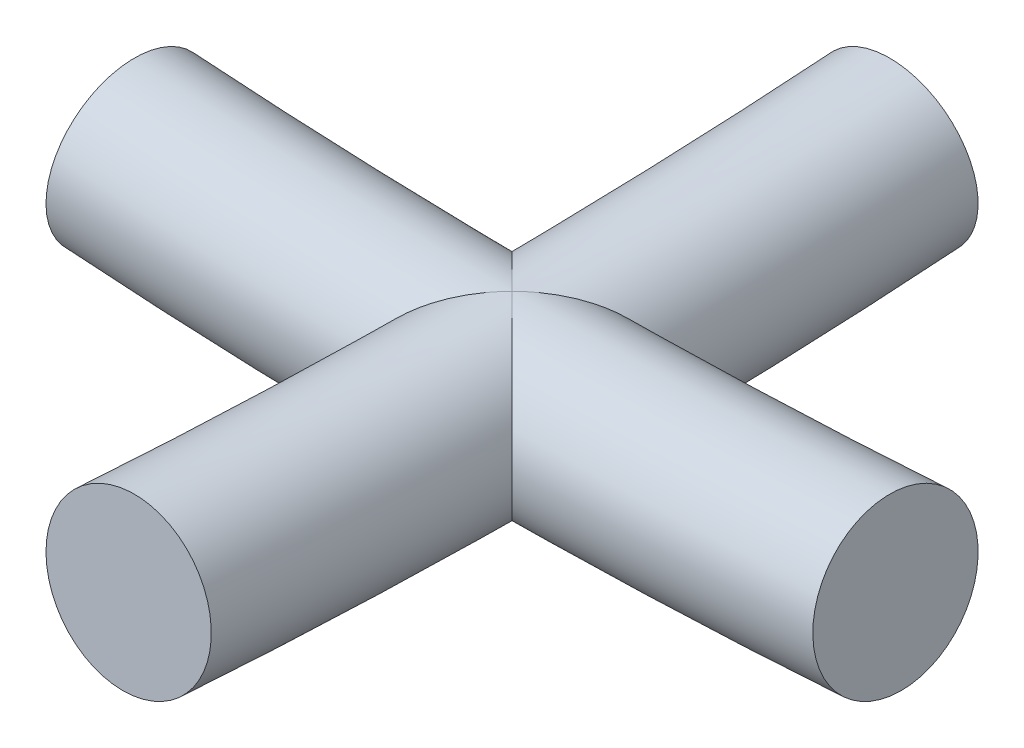
ISO-10303-21;
HEADER;
FILE_DESCRIPTION(('STEP AP214'),'2;1');
FILE_NAME('part.step','',(''),(''),'','','');
FILE_SCHEMA(('AUTOMOTIVE_DESIGN { 1 0 10303 214 1 1 1 1 }'));
ENDSEC;
DATA;
#1=APPLICATION_CONTEXT('core data for automotive mechanical design processes');
#2=APPLICATION_PROTOCOL_DEFINITION('international standard','automotive_design',2000,#1);
#3=PRODUCT_CONTEXT('',#1,'mechanical');
#4=PRODUCT('Part','Part','',(#3));
#5=PRODUCT_RELATED_PRODUCT_CATEGORY('part','',(#4));
#6=PRODUCT_DEFINITION_FORMATION('','',#4);
#7=PRODUCT_DEFINITION_CONTEXT('part definition',#1,'design');
#8=PRODUCT_DEFINITION('design','',#6,#7);
#9=PRODUCT_DEFINITION_SHAPE('','',#8);
#10=(LENGTH_UNIT() NAMED_UNIT(*) SI_UNIT(.MILLI.,.METRE.));
#11=(NAMED_UNIT(*) PLANE_ANGLE_UNIT() SI_UNIT($,.RADIAN.));
#12=(NAMED_UNIT(*) SI_UNIT($,.STERADIAN.) SOLID_ANGLE_UNIT());
#13=UNCERTAINTY_MEASURE_WITH_UNIT(LENGTH_MEASURE(1.E-05),#10,'distance_accuracy_value','');
#14=(GEOMETRIC_REPRESENTATION_CONTEXT(3) GLOBAL_UNCERTAINTY_ASSIGNED_CONTEXT((#13)) GLOBAL_UNIT_ASSIGNED_CONTEXT((#10,
#11,#12)) REPRESENTATION_CONTEXT('',''));
#15=CARTESIAN_POINT('',(0.,0.,0.));
#16=DIRECTION('',(0.,0.,1.));
#17=DIRECTION('',(1.,0.,0.));
#18=AXIS2_PLACEMENT_3D('',#15,#16,#17);
#19=CARTESIAN_POINT('',(0.,0.,0.));
#20=DIRECTION('',(1.,0.,0.));
#21=DIRECTION('',(0.,0.,-1.));
#22=AXIS2_PLACEMENT_3D('',#19,#20,#21);
#23=TOROIDAL_SURFACE('',#22,500.,7.5);
#24=CARTESIAN_POINT('',(0.,-498.782025129912,34.8782368720627));
#25=DIRECTION('',(0.,0.0697564737441254,0.997564050259824));
#26=DIRECTION('',(1.,0.,0.));
#27=AXIS2_PLACEMENT_3D('',#24,#25,#26);
#28=CIRCLE('',#27,7.5);
#29=CARTESIAN_POINT('',(7.5,-498.782025129912,34.8782368720627));
#30=VERTEX_POINT('',#29);
#31=EDGE_CURVE('E63',#30,#30,#28,.T.);
#32=ORIENTED_EDGE('',*,*,#31,.F.);
#33=EDGE_LOOP('',(#32));
#34=FACE_BOUND('',#33,.T.);
#35=CARTESIAN_POINT('',(0.,-492.5,0.));
#36=CARTESIAN_POINT('',(0.00405172274306531,-492.500000002465,0.00405172274300499));
#37=CARTESIAN_POINT('',(0.00810347235606191,-492.500003235684,0.0081034723560016));
#38=CARTESIAN_POINT('',(0.30412747375519,-492.500475521397,0.30412747375513));
#39=CARTESIAN_POINT('',(0.596223350613864,-492.517719478198,0.596223350613803));
#40=CARTESIAN_POINT('',(1.17860997817004,-492.586052900552,1.17860997816998));
#41=CARTESIAN_POINT('',(1.46889907334523,-492.637169795271,1.46889907334517));
#42=CARTESIAN_POINT('',(2.04599874856979,-492.774192245623,2.04599874856973));
#43=CARTESIAN_POINT('',(2.33280098382238,-492.860168858014,2.33280098382232));
#44=CARTESIAN_POINT('',(2.89968640547073,-493.068170051108,2.89968640547067));
#45=CARTESIAN_POINT('',(3.17977354880976,-493.190172808933,3.1797735488097));
#46=CARTESIAN_POINT('',(3.64189763278578,-493.426803594531,3.64189763278572));
#47=CARTESIAN_POINT('',(3.8265517152731,-493.531230649731,3.82655171527304));
#48=CARTESIAN_POINT('',(4.19013890945707,-493.758183584028,4.19013890945701));
#49=CARTESIAN_POINT('',(4.36907213466653,-493.880709103745,4.36907213466647));
#50=CARTESIAN_POINT('',(4.89471207725531,-494.276293240661,4.89471207725525));
#51=CARTESIAN_POINT('',(5.23135241857838,-494.577901951831,5.23135241857832));
#52=CARTESIAN_POINT('',(5.66269171513338,-495.046842414186,5.66269171513332));
#53=CARTESIAN_POINT('',(5.77663207807122,-495.179642106875,5.77663207807116));
#54=CARTESIAN_POINT('',(5.9973891511842,-495.456714846741,5.99738915118414));
#55=CARTESIAN_POINT('',(6.10420588545214,-495.600987855111,6.10420588545208));
#56=CARTESIAN_POINT('',(6.30937966420669,-495.900920649429,6.30937966420663));
#57=CARTESIAN_POINT('',(6.40774276916204,-496.056572127392,6.40774276916198));
#58=CARTESIAN_POINT('',(6.59467565510937,-496.379143868614,6.59467565510931));
#59=CARTESIAN_POINT('',(6.68325116657417,-496.546057444903,6.68325116657411));
#60=CARTESIAN_POINT('',(6.83250008782514,-496.856162785988,6.83250008782508));
#61=CARTESIAN_POINT('',(6.89520703463394,-496.997400371629,6.89520703463388));
#62=CARTESIAN_POINT('',(7.01259020844343,-497.286333633437,7.01259020844337));
#63=CARTESIAN_POINT('',(7.06727051426101,-497.434025979691,7.06727051426094));
#64=CARTESIAN_POINT('',(7.16780864980149,-497.735265923292,7.16780864980143));
#65=CARTESIAN_POINT('',(7.21366902057639,-497.888811818891,7.21366902057633));
#66=CARTESIAN_POINT('',(7.29582258392754,-498.200960973281,7.29582258392748));
#67=CARTESIAN_POINT('',(7.33211567371422,-498.359564286387,7.33211567371416));
#68=CARTESIAN_POINT('',(7.39466754778453,-498.681793597484,7.39466754778447));
#69=CARTESIAN_POINT('',(7.42086033344639,-498.845445327509,7.42086033344633));
#70=CARTESIAN_POINT('',(7.46235993995,-499.175497687257,7.46235993994994));
#71=CARTESIAN_POINT('',(7.47766672989689,-499.341898324781,7.47766672989683));
#72=CARTESIAN_POINT('',(7.49708700520648,-499.675962005662,7.49708700520642));
#73=CARTESIAN_POINT('',(7.5012032851292,-499.843624723357,7.50120328512914));
#74=CARTESIAN_POINT('',(7.49819059113224,-500.178738845475,7.49819059113217));
#75=CARTESIAN_POINT('',(7.49106242490943,-500.346190264213,7.49106242490937));
#76=CARTESIAN_POINT('',(7.46704113695181,-500.6625119158,7.46704113695175));
#77=CARTESIAN_POINT('',(7.45121019192246,-500.811546307664,7.4512101919224));
#78=CARTESIAN_POINT('',(7.41091735722183,-501.107309623359,7.41091735722177));
#79=CARTESIAN_POINT('',(7.38645262623401,-501.254037771596,7.38645262623395));
#80=CARTESIAN_POINT('',(7.32931919351315,-501.544203758762,7.32931919351309));
#81=CARTESIAN_POINT('',(7.29665297759097,-501.68764258031,7.29665297759091));
#82=CARTESIAN_POINT('',(7.22360533429434,-501.970584582745,7.22360533429428));
#83=CARTESIAN_POINT('',(7.18322086617363,-502.11008618755,7.18322086617357));
#84=CARTESIAN_POINT('',(7.09298483451151,-502.391731169253,7.09298483451145));
#85=CARTESIAN_POINT('',(7.04274659558109,-502.533626518945,7.04274659558102));
#86=CARTESIAN_POINT('',(6.93501880569529,-502.811825131596,6.93501880569523));
#87=CARTESIAN_POINT('',(6.87752691094487,-502.948126568104,6.8775269109448));
#88=CARTESIAN_POINT('',(6.6952051387422,-503.348001265091,6.69520513874213));
#89=CARTESIAN_POINT('',(6.56050056443409,-503.602632191103,6.56050056443403));
#90=CARTESIAN_POINT('',(6.19057955654988,-504.218190621189,6.19057955654982));
#91=CARTESIAN_POINT('',(5.94059235257446,-504.561427007098,5.9405923525744));
#92=CARTESIAN_POINT('',(5.53921051129636,-505.030202068354,5.5392105112963));
#93=CARTESIAN_POINT('',(5.40076363574845,-505.178989710427,5.40076363574839));
#94=CARTESIAN_POINT('',(5.1163811368633,-505.461599347489,5.11638113686323));
#95=CARTESIAN_POINT('',(4.97044551049435,-505.59542133642,4.97044551049429));
#96=CARTESIAN_POINT('',(4.61104580854305,-505.900494618956,4.61104580854299));
#97=CARTESIAN_POINT('',(4.39450170738373,-506.064492777644,4.39450170738367));
#98=CARTESIAN_POINT('',(3.95190284198422,-506.364551978632,3.95190284198416));
#99=CARTESIAN_POINT('',(3.72584369394182,-506.500599970071,3.72584369394176));
#100=CARTESIAN_POINT('',(3.26649942040137,-506.745809933948,3.26649942040131));
#101=CARTESIAN_POINT('',(3.03321210724088,-506.854963675351,3.03321210724081));
#102=CARTESIAN_POINT('',(2.56144798014355,-507.04720769992,2.56144798014349));
#103=CARTESIAN_POINT('',(2.32297273824901,-507.130305763987,2.32297273824896));
#104=CARTESIAN_POINT('',(1.74214076296989,-507.300590048811,1.74214076296982));
#105=CARTESIAN_POINT('',(1.39790050721653,-507.375053964731,1.39790050721645));
#106=CARTESIAN_POINT('',(0.706477363017954,-507.474417154022,0.706477363017903));
#107=CARTESIAN_POINT('',(0.359301337173446,-507.499410666167,0.359301337173438));
#108=CARTESIAN_POINT('',(0.00822594398091709,-507.499996564072,0.0082259439808562));
#109=CARTESIAN_POINT('',(0.00411295530615033,-507.499999997282,0.00411295530608882));
#110=CARTESIAN_POINT('',(0.,-507.5,0.));
#111=B_SPLINE_CURVE_WITH_KNOTS('',3,(#35,#36,#37,#38,#39,#40,#41,#42,#43,#44,#45,#46,#47,#48,
#49,#50,#51,#52,#53,#54,#55,#56,#57,#58,#59,#60,#61,#62,#63,#64,#65,#66,#67,#68,#69,#70,#71,#72,
#73,#74,#75,#76,#77,#78,#79,#80,#81,#82,#83,#84,#85,#86,#87,#88,#89,#90,#91,#92,#93,#94,#95,#96,
#97,#98,#99,#100,#101,#102,#103,#104,#105,#106,#107,#108,#109,#110),.UNSPECIFIED.,.F.,.F.,(4,2,
2,2,2,2,2,2,2,2,2,2,2,2,2,2,2,2,2,2,2,2,2,2,2,2,2,2,2,2,2,2,2,2,2,2,2,4),(0.,0.017190116174422,
1.25591597569802,2.4956461415085,3.73791613445178,4.97943515928004,5.82247951760151,
6.6655071379076,8.34668699965468,8.97271634482864,9.5987435726035,10.2243181865191,
10.8495245742734,11.3493707895381,11.8489621171227,12.3484092944911,12.8478618376328,
13.350524790622,13.8531891701816,14.355728009898,14.8582307535219,15.3098371563942,
15.7615923184735,16.2132107217727,16.6650074165209,17.1406067607188,17.6163601756342,
18.567581132254,20.037167528878,20.7744210277339,21.5116748250576,22.5522569936114,
23.593323945694,24.6347091235853,25.6757830200464,27.1506210298236,28.6226468287827,
28.6400967601891),.UNSPECIFIED.);
#112=CARTESIAN_POINT('',(0.,-492.5,0.));
#113=VERTEX_POINT('',#112);
#114=CARTESIAN_POINT('',(0.,-507.5,0.));
#115=VERTEX_POINT('',#114);
#116=EDGE_CURVE('E11',#113,#115,#111,.T.);
#117=ORIENTED_EDGE('',*,*,#116,.F.);
#118=CARTESIAN_POINT('',(0.,-507.5,0.));
#119=CARTESIAN_POINT('',(-0.00411296008684814,-507.499999998436,0.00411296008678599));
#120=CARTESIAN_POINT('',(-0.00822594877780701,-507.499996565199,0.00822594877774486));
#121=CARTESIAN_POINT('',(-0.296726746646961,-507.499515016277,0.296726746646899));
#122=CARTESIAN_POINT('',(-0.581235057174428,-507.482632736986,0.581235057174365));
#123=CARTESIAN_POINT('',(-1.14847424226384,-507.415829714857,1.14847424226378));
#124=CARTESIAN_POINT('',(-1.43120352610779,-507.365882749092,1.43120352610773));
#125=CARTESIAN_POINT('',(-1.99332412477934,-507.232193962043,1.99332412477927));
#126=CARTESIAN_POINT('',(-2.27270664054146,-507.148377396172,2.27270664054137));
#127=CARTESIAN_POINT('',(-2.82501193746472,-506.946016053837,2.82501193746468));
#128=CARTESIAN_POINT('',(-3.09793808275173,-506.827489813902,3.09793808275174));
#129=CARTESIAN_POINT('',(-3.55878209527001,-506.592946364011,3.5587820952699));
#130=CARTESIAN_POINT('',(-3.74892990001278,-506.485682923774,3.74892990001254));
#131=CARTESIAN_POINT('',(-4.12318266576039,-506.252036228184,4.12318266576014));
#132=CARTESIAN_POINT('',(-4.30728767418397,-506.12565312291,4.30728767418385));
#133=CARTESIAN_POINT('',(-4.84785184874006,-505.71711622169,4.84785184874012));
#134=CARTESIAN_POINT('',(-5.19369305259328,-505.405014980414,5.19369305259324));
#135=CARTESIAN_POINT('',(-5.63563405267224,-504.920399757939,5.63563405267217));
#136=CARTESIAN_POINT('',(-5.75187122183108,-504.783730594068,5.75187122183101));
#137=CARTESIAN_POINT('',(-5.97696516791961,-504.498757686729,5.97696516791955));
#138=CARTESIAN_POINT('',(-6.08582272649825,-504.350455179066,6.08582272649819));
#139=CARTESIAN_POINT('',(-6.39930165173129,-503.8882369744,6.39930165173123));
#140=CARTESIAN_POINT('',(-6.59128656510251,-503.556519842209,6.59128656510245));
#141=CARTESIAN_POINT('',(-6.89462143908579,-502.920990106235,6.89462143908573));
#142=CARTESIAN_POINT('',(-7.01443177285068,-502.625312843618,7.01443177285062));
#143=CARTESIAN_POINT('',(-7.16720089601508,-502.164104893629,7.16720089601502));
#144=CARTESIAN_POINT('',(-7.21364078925464,-502.007380464186,7.21364078925458));
#145=CARTESIAN_POINT('',(-7.29674965759596,-501.688864339679,7.2967496575959));
#146=CARTESIAN_POINT('',(-7.33342291781458,-501.527074901829,7.33342291781452));
#147=CARTESIAN_POINT('',(-7.39652256881554,-501.198237547431,7.39652256881548));
#148=CARTESIAN_POINT('',(-7.42287042658969,-501.031159393187,7.42287042658963));
#149=CARTESIAN_POINT('',(-7.46434225054951,-500.694223768824,7.46434225054945));
#150=CARTESIAN_POINT('',(-7.47946618560727,-500.524366291,7.47946618560721));
#151=CARTESIAN_POINT('',(-7.49810964929442,-500.18344697017,7.49810964929436));
#152=CARTESIAN_POINT('',(-7.50163392741187,-500.012385648839,7.50163392741181));
#153=CARTESIAN_POINT('',(-7.49697180256884,-499.670591481287,7.49697180256878));
#154=CARTESIAN_POINT('',(-7.488786483662,-499.499858606126,7.48878648366194));
#155=CARTESIAN_POINT('',(-7.46246499943983,-499.179736732955,7.46246499943977));
#156=CARTESIAN_POINT('',(-7.44557371661093,-499.030139511416,7.44557371661088));
#157=CARTESIAN_POINT('',(-7.40300499444454,-498.733418341218,7.40300499444449));
#158=CARTESIAN_POINT('',(-7.37732469376992,-498.586295214405,7.37732469376986));
#159=CARTESIAN_POINT('',(-7.31759864276457,-498.295547392247,7.31759864276451));
#160=CARTESIAN_POINT('',(-7.28355551159417,-498.151921617014,7.28355551159411));
#161=CARTESIAN_POINT('',(-7.20759697384567,-497.868845378402,7.20759697384561));
#162=CARTESIAN_POINT('',(-7.16567844444104,-497.729396596842,7.16567844444098));
#163=CARTESIAN_POINT('',(-7.0729372178395,-497.450502025904,7.07293721783943));
#164=CARTESIAN_POINT('',(-7.02185175620003,-497.311231239743,7.02185175619997));
#165=CARTESIAN_POINT('',(-6.9125316780674,-497.038395042459,6.91253167806734));
#166=CARTESIAN_POINT('',(-6.85429477235543,-496.90483147679,6.85429477235537));
#167=CARTESIAN_POINT('',(-6.66989643407295,-496.513338753572,6.66989643407289));
#168=CARTESIAN_POINT('',(-6.53401251007219,-496.26450501257,6.53401251007212));
#169=CARTESIAN_POINT('',(-6.16158265265473,-495.663942326435,6.16158265265467));
#170=CARTESIAN_POINT('',(-5.91055779204382,-495.330119595269,5.91055779204376));
#171=CARTESIAN_POINT('',(-5.50848374922241,-494.875414925409,5.50848374922235));
#172=CARTESIAN_POINT('',(-5.36994334249538,-494.7313109146,5.36994334249532));
#173=CARTESIAN_POINT('',(-5.08566844126367,-494.45796114918,5.08566844126361));
#174=CARTESIAN_POINT('',(-4.93993394509967,-494.328715397996,4.9399339450996));
#175=CARTESIAN_POINT('',(-4.5758697171878,-494.029918577291,4.57586971718773));
#176=CARTESIAN_POINT('',(-4.35429022079139,-493.868281329408,4.35429022079133));
#177=CARTESIAN_POINT('',(-3.90174490101171,-493.573711496582,3.90174490101165));
#178=CARTESIAN_POINT('',(-3.67077431101529,-493.440793710374,3.67077431101523));
#179=CARTESIAN_POINT('',(-3.20182715278346,-493.202328290752,3.2018271527834));
#180=CARTESIAN_POINT('',(-2.96384843958099,-493.096789136098,2.96384843958093));
#181=CARTESIAN_POINT('',(-2.4829624183365,-492.912035123732,2.48296241833644));
#182=CARTESIAN_POINT('',(-2.24005675116175,-492.832811649792,2.24005675116168));
#183=CARTESIAN_POINT('',(-1.66860889421815,-492.677395597215,1.66860889421809));
#184=CARTESIAN_POINT('',(-1.33870447612159,-492.611157118523,1.33870447612155));
#185=CARTESIAN_POINT('',(-0.676522400587747,-492.522769386523,0.676522400587656));
#186=CARTESIAN_POINT('',(-0.344250208419991,-492.500539458485,0.344250208419835));
#187=CARTESIAN_POINT('',(-0.00810346979936537,-492.500003236606,0.00810346979930272));
#188=CARTESIAN_POINT('',(-0.00405172019925466,-492.500000003406,0.00405172019919317));
#189=CARTESIAN_POINT('',(0.,-492.5,0.));
#190=B_SPLINE_CURVE_WITH_KNOTS('',3,(#118,#119,#120,#121,#122,#123,#124,#125,#126,#127,#128,
#129,#130,#131,#132,#133,#134,#135,#136,#137,#138,#139,#140,#141,#142,#143,#144,#145,#146,#147,
#148,#149,#150,#151,#152,#153,#154,#155,#156,#157,#158,#159,#160,#161,#162,#163,#164,#165,#166,
#167,#168,#169,#170,#171,#172,#173,#174,#175,#176,#177,#178,#179,#180,#181,#182,#183,#184,#185,
#186,#187,#188,#189),.UNSPECIFIED.,.F.,.F.,(4,2,2,2,2,2,2,2,2,2,2,2,2,2,2,2,2,2,2,2,2,2,2,2,2,2,
2,2,2,2,2,2,2,2,2,4),(0.,0.0174499314064598,1.22399759742011,2.4315032999273,3.64168844819305,
4.85122847805522,5.71900898120031,6.5867826731101,8.31728300330255,8.9581700357246,
9.59898907893289,10.8782161024738,11.8962056521586,12.405445112385,12.9144607739753,
13.427276070808,13.9400927898537,14.4526995095781,14.9652587761561,15.4192080783133,
15.8733053082063,16.3272605000062,16.7813960797474,17.2516147556117,17.7219843455044,
18.6623853930822,20.1157195878404,20.8448916311593,21.5740638426626,22.6301992346208,
23.6868775472256,24.7438827080057,25.8005414443621,27.2120817298534,28.6210320307507,
28.6382221469251),.UNSPECIFIED.);
#191=EDGE_CURVE('E47',#115,#113,#190,.T.);
#192=ORIENTED_EDGE('',*,*,#191,.F.);
#193=EDGE_LOOP('',(#117,#192));
#194=FACE_BOUND('',#193,.T.);
#195=ADVANCED_FACE('F34',(#34,#194),#23,.T.);
#196=CARTESIAN_POINT('',(0.,-498.782025129912,34.8782368720627));
#197=DIRECTION('',(0.,0.0697564737441254,0.997564050259824));
#198=DIRECTION('',(1.,0.,0.));
#199=AXIS2_PLACEMENT_3D('',#196,#197,#198);
#200=PLANE('',#199);
#201=ORIENTED_EDGE('',*,*,#31,.T.);
#202=EDGE_LOOP('',(#201));
#203=FACE_BOUND('',#202,.T.);
#204=ADVANCED_FACE('F94',(#203),#200,.T.);
#205=CARTESIAN_POINT('',(34.8782368720627,-498.782025129912,0.));
#206=DIRECTION('',(0.997564050259824,0.0697564737441254,0.));
#207=DIRECTION('',(0.,0.,-1.));
#208=AXIS2_PLACEMENT_3D('',#205,#206,#207);
#209=PLANE('',#208);
#210=CARTESIAN_POINT('',(34.8782368720627,-498.782025129912,0.));
#211=DIRECTION('',(0.997564050259824,0.0697564737441254,0.));
#212=DIRECTION('',(0.,0.,-1.));
#213=AXIS2_PLACEMENT_3D('',#210,#211,#212);
#214=CIRCLE('',#213,7.5);
#215=CARTESIAN_POINT('',(34.8782368720627,-498.782025129912,-7.50000000000006));
#216=VERTEX_POINT('',#215);
#217=EDGE_CURVE('E107',#216,#216,#214,.T.);
#218=ORIENTED_EDGE('',*,*,#217,.T.);
#219=EDGE_LOOP('',(#218));
#220=FACE_BOUND('',#219,.T.);
#221=ADVANCED_FACE('F86',(#220),#209,.T.);
#222=CARTESIAN_POINT('',(0.,0.,0.));
#223=DIRECTION('',(0.,0.,-1.));
#224=DIRECTION('',(-1.,0.,0.));
#225=AXIS2_PLACEMENT_3D('',#222,#223,#224);
#226=TOROIDAL_SURFACE('',#225,500.,7.5);
#227=ORIENTED_EDGE('',*,*,#217,.F.);
#228=EDGE_LOOP('',(#227));
#229=FACE_BOUND('',#228,.T.);
#230=CARTESIAN_POINT('',(0.,-507.5,0.));
#231=CARTESIAN_POINT('',(0.00411296008684814,-507.499999998436,-0.00411296008691029));
#232=CARTESIAN_POINT('',(0.008225948777807,-507.499996565199,-0.00822594877786916));
#233=CARTESIAN_POINT('',(0.296726746646961,-507.499515016277,-0.296726746647023));
#234=CARTESIAN_POINT('',(0.581235057174428,-507.482632736986,-0.581235057174489));
#235=CARTESIAN_POINT('',(1.14847424226384,-507.415829714857,-1.1484742422639));
#236=CARTESIAN_POINT('',(1.43120352610779,-507.365882749092,-1.43120352610785));
#237=CARTESIAN_POINT('',(1.99332412477933,-507.232193962043,-1.99332412477939));
#238=CARTESIAN_POINT('',(2.27270664054144,-507.148377396172,-2.2727066405415));
#239=CARTESIAN_POINT('',(2.82501193746473,-506.946016053837,-2.82501193746479));
#240=CARTESIAN_POINT('',(3.09793808275178,-506.827489813902,-3.09793808275184));
#241=CARTESIAN_POINT('',(3.55878209526998,-506.592946364011,-3.55878209527004));
#242=CARTESIAN_POINT('',(3.74892990001267,-506.485682923774,-3.74892990001274));
#243=CARTESIAN_POINT('',(4.12318266576028,-506.252036228184,-4.12318266576034));
#244=CARTESIAN_POINT('',(4.30728767418394,-506.12565312291,-4.307287674184));
#245=CARTESIAN_POINT('',(4.84785184874015,-505.71711622169,-4.84785184874021));
#246=CARTESIAN_POINT('',(5.1936930525933,-505.405014980414,-5.19369305259336));
#247=CARTESIAN_POINT('',(5.63563405267224,-504.920399757939,-5.6356340526723));
#248=CARTESIAN_POINT('',(5.75187122183108,-504.783730594068,-5.75187122183114));
#249=CARTESIAN_POINT('',(5.97696516791961,-504.498757686729,-5.97696516791967));
#250=CARTESIAN_POINT('',(6.08582272649825,-504.350455179066,-6.08582272649832));
#251=CARTESIAN_POINT('',(6.39930165173129,-503.8882369744,-6.39930165173136));
#252=CARTESIAN_POINT('',(6.59128656510251,-503.556519842209,-6.59128656510258));
#253=CARTESIAN_POINT('',(6.8946214390858,-502.920990106235,-6.89462143908586));
#254=CARTESIAN_POINT('',(7.01443177285069,-502.625312843618,-7.01443177285075));
#255=CARTESIAN_POINT('',(7.16720089601509,-502.164104893629,-7.16720089601515));
#256=CARTESIAN_POINT('',(7.21364078925466,-502.007380464186,-7.21364078925472));
#257=CARTESIAN_POINT('',(7.29674965759599,-501.688864339679,-7.29674965759605));
#258=CARTESIAN_POINT('',(7.33342291781461,-501.527074901829,-7.33342291781467));
#259=CARTESIAN_POINT('',(7.39652256881556,-501.198237547431,-7.39652256881562));
#260=CARTESIAN_POINT('',(7.42287042658971,-501.031159393186,-7.42287042658977));
#261=CARTESIAN_POINT('',(7.46434225054952,-500.694223768824,-7.46434225054958));
#262=CARTESIAN_POINT('',(7.47946618560728,-500.524366291,-7.47946618560734));
#263=CARTESIAN_POINT('',(7.49810964929442,-500.18344697017,-7.49810964929448));
#264=CARTESIAN_POINT('',(7.50163392741188,-500.012385648838,-7.50163392741194));
#265=CARTESIAN_POINT('',(7.49697180256884,-499.670591481287,-7.4969718025689));
#266=CARTESIAN_POINT('',(7.48878648366199,-499.499858606126,-7.48878648366205));
#267=CARTESIAN_POINT('',(7.46246499943982,-499.179736732955,-7.46246499943989));
#268=CARTESIAN_POINT('',(7.44557371661093,-499.030139511416,-7.44557371661099));
#269=CARTESIAN_POINT('',(7.40300499444454,-498.733418341218,-7.40300499444461));
#270=CARTESIAN_POINT('',(7.37732469376992,-498.586295214405,-7.37732469376998));
#271=CARTESIAN_POINT('',(7.31759864276456,-498.295547392247,-7.31759864276462));
#272=CARTESIAN_POINT('',(7.28355551159415,-498.151921617014,-7.28355551159421));
#273=CARTESIAN_POINT('',(7.20759697384564,-497.868845378402,-7.20759697384571));
#274=CARTESIAN_POINT('',(7.16567844444101,-497.729396596842,-7.16567844444107));
#275=CARTESIAN_POINT('',(7.07293721783946,-497.450502025904,-7.07293721783952));
#276=CARTESIAN_POINT('',(7.02185175619999,-497.311231239743,-7.02185175620005));
#277=CARTESIAN_POINT('',(6.91253167806735,-497.038395042459,-6.91253167806741));
#278=CARTESIAN_POINT('',(6.85429477235538,-496.90483147679,-6.85429477235544));
#279=CARTESIAN_POINT('',(6.6698964340729,-496.513338753572,-6.66989643407296));
#280=CARTESIAN_POINT('',(6.53401251007213,-496.26450501257,-6.53401251007219));
#281=CARTESIAN_POINT('',(6.16158265265466,-495.663942326435,-6.16158265265472));
#282=CARTESIAN_POINT('',(5.91055779204374,-495.330119595269,-5.9105577920438));
#283=CARTESIAN_POINT('',(5.5084837492223,-494.875414925409,-5.50848374922237));
#284=CARTESIAN_POINT('',(5.36994334249527,-494.7313109146,-5.36994334249533));
#285=CARTESIAN_POINT('',(5.08566844126356,-494.45796114918,-5.08566844126362));
#286=CARTESIAN_POINT('',(4.93993394509956,-494.328715397995,-4.93993394509962));
#287=CARTESIAN_POINT('',(4.57586971718769,-494.029918577291,-4.57586971718775));
#288=CARTESIAN_POINT('',(4.35429022079127,-493.868281329408,-4.35429022079133));
#289=CARTESIAN_POINT('',(3.90174490101157,-493.573711496582,-3.90174490101163));
#290=CARTESIAN_POINT('',(3.67077431101514,-493.440793710374,-3.67077431101519));
#291=CARTESIAN_POINT('',(3.20182715278329,-493.202328290752,-3.20182715278335));
#292=CARTESIAN_POINT('',(2.96384843958081,-493.096789136098,-2.96384843958088));
#293=CARTESIAN_POINT('',(2.48296241833631,-492.912035123732,-2.48296241833637));
#294=CARTESIAN_POINT('',(2.24005675116155,-492.832811649792,-2.24005675116161));
#295=CARTESIAN_POINT('',(1.66860889421798,-492.677395597215,-1.66860889421804));
#296=CARTESIAN_POINT('',(1.33870447612146,-492.611157118523,-1.33870447612153));
#297=CARTESIAN_POINT('',(0.67652240058766,-492.522769386523,-0.676522400587725));
#298=CARTESIAN_POINT('',(0.344250208419909,-492.500539458485,-0.344250208419969));
#299=CARTESIAN_POINT('',(0.00810346979936407,-492.500003236606,-0.00810346979942436));
#300=CARTESIAN_POINT('',(0.004051720199254,-492.500000003406,-0.0040517201993143));
#301=CARTESIAN_POINT('',(0.,-492.5,0.));
#302=B_SPLINE_CURVE_WITH_KNOTS('',3,(#230,#231,#232,#233,#234,#235,#236,#237,#238,#239,#240,
#241,#242,#243,#244,#245,#246,#247,#248,#249,#250,#251,#252,#253,#254,#255,#256,#257,#258,#259,
#260,#261,#262,#263,#264,#265,#266,#267,#268,#269,#270,#271,#272,#273,#274,#275,#276,#277,#278,
#279,#280,#281,#282,#283,#284,#285,#286,#287,#288,#289,#290,#291,#292,#293,#294,#295,#296,#297,
#298,#299,#300,#301),.UNSPECIFIED.,.F.,.F.,(4,2,2,2,2,2,2,2,2,2,2,2,2,2,2,2,2,2,2,2,2,2,2,2,2,2,
2,2,2,2,2,2,2,2,2,4),(0.,0.0174499314064598,1.22399759742011,2.4315032999273,3.64168844819305,
4.85122847805522,5.71900898120033,6.58678267311009,8.31728300330255,8.95817003572459,
9.59898907893288,10.8782161024738,11.8962056521586,12.4054451123851,12.9144607739754,
13.4272760708081,13.9400927898538,14.4526995095782,14.9652587761562,15.4192080783134,
15.8733053082062,16.3272605000063,16.7813960797475,17.2516147556118,17.7219843455045,
18.6623853930823,20.1157195878406,20.8448916311595,21.5740638426628,22.630199234621,
23.6868775472259,24.7438827080059,25.8005414443624,27.2120817298535,28.6210320307507,
28.6382221469251),.UNSPECIFIED.);
#303=EDGE_CURVE('E57',#115,#113,#302,.T.);
#304=ORIENTED_EDGE('',*,*,#303,.T.);
#305=ORIENTED_EDGE('',*,*,#116,.T.);
#306=EDGE_LOOP('',(#304,#305));
#307=FACE_BOUND('',#306,.T.);
#308=ADVANCED_FACE('F56',(#229,#307),#226,.T.);
#309=CARTESIAN_POINT('',(0.,-498.782025129912,-34.8782368720627));
#310=DIRECTION('',(0.,-0.0697564737441255,0.997564050259824));
#311=DIRECTION('',(1.,0.,0.));
#312=AXIS2_PLACEMENT_3D('',#309,#310,#311);
#313=PLANE('',#312);
#314=CARTESIAN_POINT('',(0.,-498.782025129912,-34.8782368720627));
#315=DIRECTION('',(0.,-0.0697564737441255,0.997564050259824));
#316=DIRECTION('',(1.,0.,0.));
#317=AXIS2_PLACEMENT_3D('',#314,#315,#316);
#318=CIRCLE('',#317,7.5);
#319=CARTESIAN_POINT('',(7.5,-498.782025129912,-34.8782368720627));
#320=VERTEX_POINT('',#319);
#321=EDGE_CURVE('E105',#320,#320,#318,.T.);
#322=ORIENTED_EDGE('',*,*,#321,.F.);
#323=EDGE_LOOP('',(#322));
#324=FACE_BOUND('',#323,.T.);
#325=ADVANCED_FACE('F85',(#324),#313,.F.);
#326=ORIENTED_EDGE('',*,*,#321,.T.);
#327=EDGE_LOOP('',(#326));
#328=FACE_BOUND('',#327,.T.);
#329=CARTESIAN_POINT('',(0.,-492.5,0.));
#330=CARTESIAN_POINT('',(-0.0040517227430653,-492.500000002465,-0.00405172274312562));
#331=CARTESIAN_POINT('',(-0.00810347235606191,-492.500003235684,-0.00810347235612223));
#332=CARTESIAN_POINT('',(-0.30412747375519,-492.500475521397,-0.30412747375525));
#333=CARTESIAN_POINT('',(-0.596223350613867,-492.517719478198,-0.596223350613921));
#334=CARTESIAN_POINT('',(-1.17860997817004,-492.586052900552,-1.17860997817009));
#335=CARTESIAN_POINT('',(-1.46889907334523,-492.637169795271,-1.46889907334529));
#336=CARTESIAN_POINT('',(-2.04599874856978,-492.774192245623,-2.04599874856985));
#337=CARTESIAN_POINT('',(-2.33280098382238,-492.860168858014,-2.33280098382244));
#338=CARTESIAN_POINT('',(-2.89968640547073,-493.068170051108,-2.89968640547079));
#339=CARTESIAN_POINT('',(-3.17977354880976,-493.190172808933,-3.17977354880982));
#340=CARTESIAN_POINT('',(-3.64189763278578,-493.426803594531,-3.64189763278584));
#341=CARTESIAN_POINT('',(-3.8265517152731,-493.531230649731,-3.82655171527316));
#342=CARTESIAN_POINT('',(-4.19013890945707,-493.758183584028,-4.19013890945713));
#343=CARTESIAN_POINT('',(-4.36907213466653,-493.880709103745,-4.36907213466659));
#344=CARTESIAN_POINT('',(-4.89471207725531,-494.276293240661,-4.89471207725537));
#345=CARTESIAN_POINT('',(-5.23135241857836,-494.577901951831,-5.23135241857843));
#346=CARTESIAN_POINT('',(-5.66269171513337,-495.046842414186,-5.66269171513343));
#347=CARTESIAN_POINT('',(-5.77663207807121,-495.179642106875,-5.77663207807127));
#348=CARTESIAN_POINT('',(-5.99738915118419,-495.456714846741,-5.99738915118425));
#349=CARTESIAN_POINT('',(-6.10420588545213,-495.600987855111,-6.10420588545219));
#350=CARTESIAN_POINT('',(-6.30937966420668,-495.900920649429,-6.30937966420674));
#351=CARTESIAN_POINT('',(-6.40774276916204,-496.056572127392,-6.4077427691621));
#352=CARTESIAN_POINT('',(-6.59467565510937,-496.379143868614,-6.59467565510943));
#353=CARTESIAN_POINT('',(-6.68325116657417,-496.546057444903,-6.68325116657423));
#354=CARTESIAN_POINT('',(-6.83250008782514,-496.856162785988,-6.8325000878252));
#355=CARTESIAN_POINT('',(-6.89520703463394,-496.997400371629,-6.895207034634));
#356=CARTESIAN_POINT('',(-7.01259020844343,-497.286333633437,-7.01259020844349));
#357=CARTESIAN_POINT('',(-7.06727051426101,-497.434025979691,-7.06727051426107));
#358=CARTESIAN_POINT('',(-7.16780864980149,-497.735265923292,-7.16780864980155));
#359=CARTESIAN_POINT('',(-7.21366902057639,-497.888811818891,-7.21366902057646));
#360=CARTESIAN_POINT('',(-7.29582258392754,-498.200960973281,-7.2958225839276));
#361=CARTESIAN_POINT('',(-7.33211567371422,-498.359564286387,-7.33211567371428));
#362=CARTESIAN_POINT('',(-7.39466754778453,-498.681793597484,-7.39466754778459));
#363=CARTESIAN_POINT('',(-7.42086033344639,-498.845445327509,-7.42086033344645));
#364=CARTESIAN_POINT('',(-7.46235993995,-499.175497687257,-7.46235993995006));
#365=CARTESIAN_POINT('',(-7.47766672989689,-499.341898324781,-7.47766672989696));
#366=CARTESIAN_POINT('',(-7.49708700520648,-499.675962005662,-7.49708700520654));
#367=CARTESIAN_POINT('',(-7.5012032851292,-499.843624723357,-7.50120328512926));
#368=CARTESIAN_POINT('',(-7.49819059113224,-500.178738845475,-7.4981905911323));
#369=CARTESIAN_POINT('',(-7.49106242490943,-500.346190264213,-7.49106242490949));
#370=CARTESIAN_POINT('',(-7.46704113695181,-500.6625119158,-7.46704113695187));
#371=CARTESIAN_POINT('',(-7.45121019192246,-500.811546307664,-7.45121019192252));
#372=CARTESIAN_POINT('',(-7.41091735722183,-501.107309623359,-7.4109173572219));
#373=CARTESIAN_POINT('',(-7.38645262623401,-501.254037771596,-7.38645262623407));
#374=CARTESIAN_POINT('',(-7.32931919351315,-501.544203758762,-7.32931919351321));
#375=CARTESIAN_POINT('',(-7.29665297759097,-501.68764258031,-7.29665297759103));
#376=CARTESIAN_POINT('',(-7.22360533429434,-501.970584582745,-7.2236053342944));
#377=CARTESIAN_POINT('',(-7.18322086617363,-502.11008618755,-7.18322086617369));
#378=CARTESIAN_POINT('',(-7.09298483451151,-502.391731169253,-7.09298483451157));
#379=CARTESIAN_POINT('',(-7.04274659558109,-502.533626518945,-7.04274659558115));
#380=CARTESIAN_POINT('',(-6.93501880569529,-502.811825131596,-6.93501880569535));
#381=CARTESIAN_POINT('',(-6.87752691094487,-502.948126568104,-6.87752691094493));
#382=CARTESIAN_POINT('',(-6.6952051387422,-503.348001265091,-6.69520513874226));
#383=CARTESIAN_POINT('',(-6.56050056443409,-503.602632191103,-6.56050056443415));
#384=CARTESIAN_POINT('',(-6.19057955654988,-504.218190621189,-6.19057955654994));
#385=CARTESIAN_POINT('',(-5.94059235257445,-504.561427007098,-5.94059235257451));
#386=CARTESIAN_POINT('',(-5.53921051129638,-505.030202068354,-5.53921051129644));
#387=CARTESIAN_POINT('',(-5.40076363574848,-505.178989710427,-5.40076363574854));
#388=CARTESIAN_POINT('',(-5.11638113686332,-505.461599347489,-5.11638113686339));
#389=CARTESIAN_POINT('',(-4.97044551049436,-505.59542133642,-4.97044551049443));
#390=CARTESIAN_POINT('',(-4.61104580854305,-505.900494618956,-4.61104580854311));
#391=CARTESIAN_POINT('',(-4.39450170738375,-506.064492777644,-4.39450170738381));
#392=CARTESIAN_POINT('',(-3.95190284198424,-506.364551978632,-3.9519028419843));
#393=CARTESIAN_POINT('',(-3.72584369394183,-506.500599970071,-3.72584369394189));
#394=CARTESIAN_POINT('',(-3.26649942040137,-506.745809933948,-3.26649942040143));
#395=CARTESIAN_POINT('',(-3.03321210724088,-506.854963675351,-3.03321210724094));
#396=CARTESIAN_POINT('',(-2.56144798014355,-507.04720769992,-2.56144798014361));
#397=CARTESIAN_POINT('',(-2.32297273824902,-507.130305763987,-2.32297273824908));
#398=CARTESIAN_POINT('',(-1.74214076296989,-507.300590048811,-1.74214076296995));
#399=CARTESIAN_POINT('',(-1.39790050721652,-507.375053964731,-1.39790050721658));
#400=CARTESIAN_POINT('',(-0.706477363017963,-507.474417154022,-0.70647736301802));
#401=CARTESIAN_POINT('',(-0.359301337173475,-507.499410666167,-0.359301337173533));
#402=CARTESIAN_POINT('',(-0.00822594398091707,-507.499996564072,-0.00822594398097913));
#403=CARTESIAN_POINT('',(-0.00411295530615033,-507.499999997282,-0.00411295530621243));
#404=CARTESIAN_POINT('',(0.,-507.5,0.));
#405=B_SPLINE_CURVE_WITH_KNOTS('',3,(#329,#330,#331,#332,#333,#334,#335,#336,#337,#338,#339,
#340,#341,#342,#343,#344,#345,#346,#347,#348,#349,#350,#351,#352,#353,#354,#355,#356,#357,#358,
#359,#360,#361,#362,#363,#364,#365,#366,#367,#368,#369,#370,#371,#372,#373,#374,#375,#376,#377,
#378,#379,#380,#381,#382,#383,#384,#385,#386,#387,#388,#389,#390,#391,#392,#393,#394,#395,#396,
#397,#398,#399,#400,#401,#402,#403,#404),.UNSPECIFIED.,.F.,.F.,(4,2,2,2,2,2,2,2,2,2,2,2,2,2,2,2,
2,2,2,2,2,2,2,2,2,2,2,2,2,2,2,2,2,2,2,2,2,4),(0.,0.017190116174422,1.25591597569802,
2.4956461415085,3.73791613445178,4.97943515928004,5.82247951760151,6.6655071379076,
8.34668699965468,8.97271634482858,9.5987435726035,10.2243181865191,10.8495245742734,
11.3493707895381,11.8489621171227,12.3484092944911,12.8478618376328,13.350524790622,
13.8531891701816,14.355728009898,14.8582307535219,15.3098371563942,15.7615923184735,
16.2132107217727,16.6650074165209,17.1406067607188,17.6163601756342,18.567581132254,
20.037167528878,20.7744210277338,21.5116748250576,22.5522569936113,23.593323945694,
24.6347091235853,25.6757830200464,27.1506210298236,28.6226468287827,28.6400967601891),.UNSPECIFIED.);
#406=EDGE_CURVE('E62',#113,#115,#405,.T.);
#407=ORIENTED_EDGE('',*,*,#406,.F.);
#408=ORIENTED_EDGE('',*,*,#303,.F.);
#409=EDGE_LOOP('',(#407,#408));
#410=FACE_BOUND('',#409,.T.);
#411=ADVANCED_FACE('F60',(#328,#410),#23,.T.);
#412=CARTESIAN_POINT('',(-34.8782368720627,-498.782025129912,0.));
#413=DIRECTION('',(0.997564050259824,-0.0697564737441255,0.));
#414=DIRECTION('',(0.,0.,-1.));
#415=AXIS2_PLACEMENT_3D('',#412,#413,#414);
#416=CIRCLE('',#415,7.5);
#417=CARTESIAN_POINT('',(-34.8782368720627,-498.782025129912,-7.50000000000006));
#418=VERTEX_POINT('',#417);
#419=EDGE_CURVE('E112',#418,#418,#416,.T.);
#420=ORIENTED_EDGE('',*,*,#419,.T.);
#421=EDGE_LOOP('',(#420));
#422=FACE_BOUND('',#421,.T.);
#423=ORIENTED_EDGE('',*,*,#406,.T.);
#424=ORIENTED_EDGE('',*,*,#191,.T.);
#425=EDGE_LOOP('',(#423,#424));
#426=FACE_BOUND('',#425,.T.);
#427=ADVANCED_FACE('F66',(#422,#426),#226,.T.);
#428=CARTESIAN_POINT('',(-34.8782368720627,-498.782025129912,0.));
#429=DIRECTION('',(0.997564050259824,-0.0697564737441255,0.));
#430=DIRECTION('',(0.,0.,-1.));
#431=AXIS2_PLACEMENT_3D('',#428,#429,#430);
#432=PLANE('',#431);
#433=ORIENTED_EDGE('',*,*,#419,.F.);
#434=EDGE_LOOP('',(#433));
#435=FACE_BOUND('',#434,.T.);
#436=ADVANCED_FACE('F117',(#435),#432,.F.);
#437=CLOSED_SHELL('',(#195,#204,#221,#308,#325,#411,#427,#436));
#438=MANIFOLD_SOLID_BREP('B2',#437);
#439=ADVANCED_BREP_SHAPE_REPRESENTATION('',(#18,#438),#14);
#440=SHAPE_DEFINITION_REPRESENTATION(#9,#439);
ENDSEC;
END-ISO-10303-21;
